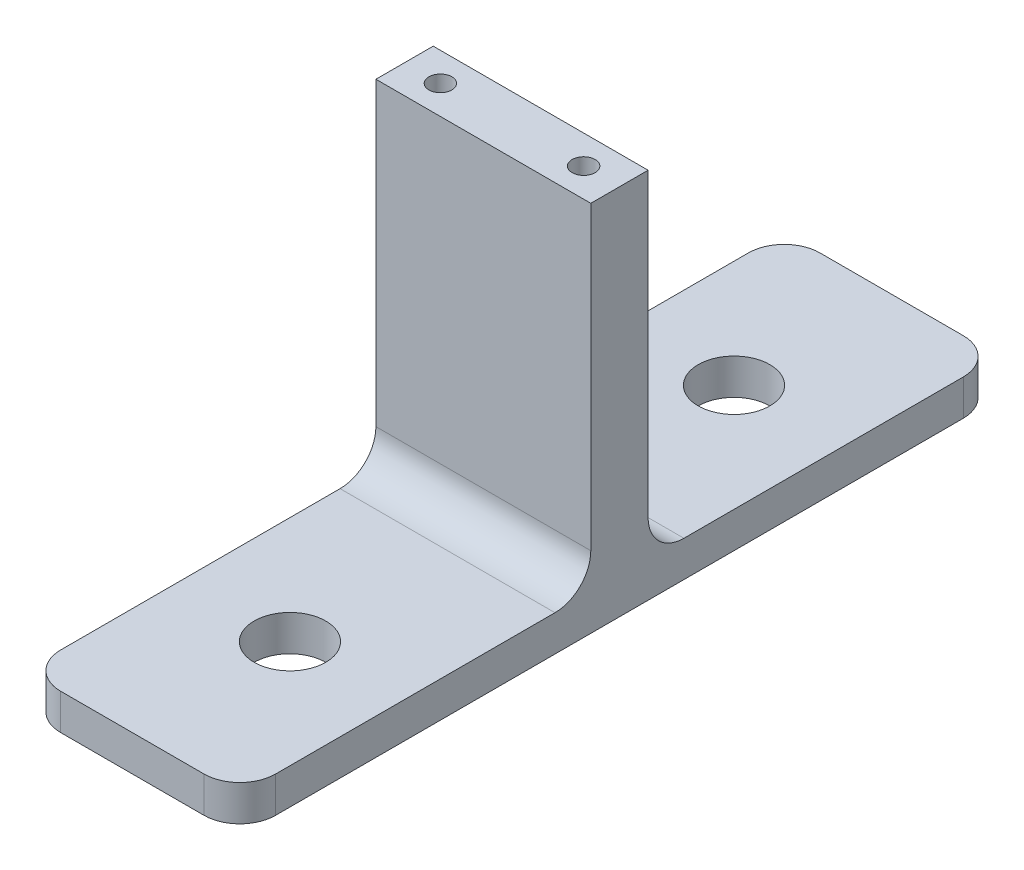
ISO-10303-21;
HEADER;
FILE_DESCRIPTION(('STEP AP214'),'2;1');
FILE_NAME('part.step','',(''),(''),'','','');
FILE_SCHEMA(('AUTOMOTIVE_DESIGN { 1 0 10303 214 1 1 1 1 }'));
ENDSEC;
DATA;
#1=APPLICATION_CONTEXT('core data for automotive mechanical design processes');
#2=APPLICATION_PROTOCOL_DEFINITION('international standard','automotive_design',2000,#1);
#3=PRODUCT_CONTEXT('',#1,'mechanical');
#4=PRODUCT('Part','Part','',(#3));
#5=PRODUCT_RELATED_PRODUCT_CATEGORY('part','',(#4));
#6=PRODUCT_DEFINITION_FORMATION('','',#4);
#7=PRODUCT_DEFINITION_CONTEXT('part definition',#1,'design');
#8=PRODUCT_DEFINITION('design','',#6,#7);
#9=PRODUCT_DEFINITION_SHAPE('','',#8);
#10=(LENGTH_UNIT() NAMED_UNIT(*) SI_UNIT(.MILLI.,.METRE.));
#11=(NAMED_UNIT(*) PLANE_ANGLE_UNIT() SI_UNIT($,.RADIAN.));
#12=(NAMED_UNIT(*) SI_UNIT($,.STERADIAN.) SOLID_ANGLE_UNIT());
#13=UNCERTAINTY_MEASURE_WITH_UNIT(LENGTH_MEASURE(1.E-05),#10,'distance_accuracy_value','');
#14=(GEOMETRIC_REPRESENTATION_CONTEXT(3) GLOBAL_UNCERTAINTY_ASSIGNED_CONTEXT((#13)) GLOBAL_UNIT_ASSIGNED_CONTEXT((#10,
#11,#12)) REPRESENTATION_CONTEXT('',''));
#15=CARTESIAN_POINT('',(0.,0.,0.));
#16=DIRECTION('',(0.,0.,1.));
#17=DIRECTION('',(1.,0.,0.));
#18=AXIS2_PLACEMENT_3D('',#15,#16,#17);
#19=CARTESIAN_POINT('',(30.,0.,0.));
#20=DIRECTION('',(0.,0.,1.));
#21=DIRECTION('',(1.,0.,0.));
#22=AXIS2_PLACEMENT_3D('',#19,#20,#21);
#23=PLANE('',#22);
#24=DIRECTION('',(-1.,0.,0.));
#25=VECTOR('',#24,1.);
#26=CARTESIAN_POINT('',(30.,0.,0.));
#27=LINE('',#26,#25);
#28=CARTESIAN_POINT('',(25.,0.,0.));
#29=VERTEX_POINT('',#28);
#30=CARTESIAN_POINT('',(5.,0.,0.));
#31=VERTEX_POINT('',#30);
#32=EDGE_CURVE('E183',#29,#31,#27,.T.);
#33=ORIENTED_EDGE('',*,*,#32,.F.);
#34=DIRECTION('',(0.,1.,0.));
#35=VECTOR('',#34,1.);
#36=CARTESIAN_POINT('',(25.,5.,0.));
#37=LINE('',#36,#35);
#38=CARTESIAN_POINT('',(25.,5.,0.));
#39=VERTEX_POINT('',#38);
#40=EDGE_CURVE('E207',#29,#39,#37,.T.);
#41=ORIENTED_EDGE('',*,*,#40,.T.);
#42=DIRECTION('',(-1.,0.,0.));
#43=VECTOR('',#42,1.);
#44=CARTESIAN_POINT('',(30.,5.,0.));
#45=LINE('',#44,#43);
#46=CARTESIAN_POINT('',(5.,5.,0.));
#47=VERTEX_POINT('',#46);
#48=EDGE_CURVE('E178',#39,#47,#45,.T.);
#49=ORIENTED_EDGE('',*,*,#48,.T.);
#50=DIRECTION('',(0.,1.,0.));
#51=VECTOR('',#50,1.);
#52=CARTESIAN_POINT('',(5.,0.,0.));
#53=LINE('',#52,#51);
#54=EDGE_CURVE('E205',#47,#31,#53,.F.);
#55=ORIENTED_EDGE('',*,*,#54,.T.);
#56=EDGE_LOOP('',(#33,#41,#49,#55));
#57=FACE_BOUND('',#56,.T.);
#58=ADVANCED_FACE('F33',(#57),#23,.T.);
#59=CARTESIAN_POINT('',(30.,0.,0.));
#60=DIRECTION('',(0.,1.,0.));
#61=DIRECTION('',(0.,0.,1.));
#62=AXIS2_PLACEMENT_3D('',#59,#60,#61);
#63=PLANE('',#62);
#64=CARTESIAN_POINT('',(15.,0.,-84.));
#65=DIRECTION('',(0.,-1.,0.));
#66=DIRECTION('',(0.,0.,-1.));
#67=AXIS2_PLACEMENT_3D('',#64,#65,#66);
#68=CIRCLE('',#67,5.);
#69=CARTESIAN_POINT('',(15.,0.,-89.));
#70=VERTEX_POINT('',#69);
#71=EDGE_CURVE('E245',#70,#70,#68,.T.);
#72=ORIENTED_EDGE('',*,*,#71,.F.);
#73=EDGE_LOOP('',(#72));
#74=FACE_BOUND('',#73,.T.);
#75=CARTESIAN_POINT('',(15.,0.,-22.));
#76=DIRECTION('',(0.,1.,0.));
#77=DIRECTION('',(0.,0.,1.));
#78=AXIS2_PLACEMENT_3D('',#75,#76,#77);
#79=CIRCLE('',#78,5.);
#80=CARTESIAN_POINT('',(15.,0.,-17.));
#81=VERTEX_POINT('',#80);
#82=EDGE_CURVE('E157',#81,#81,#79,.T.);
#83=ORIENTED_EDGE('',*,*,#82,.T.);
#84=EDGE_LOOP('',(#83));
#85=FACE_BOUND('',#84,.T.);
#86=DIRECTION('',(0.,0.,-1.));
#87=VECTOR('',#86,1.);
#88=CARTESIAN_POINT('',(0.,0.,0.));
#89=LINE('',#88,#87);
#90=CARTESIAN_POINT('',(0.,0.,-5.));
#91=VERTEX_POINT('',#90);
#92=CARTESIAN_POINT('',(0.,0.,-101.));
#93=VERTEX_POINT('',#92);
#94=EDGE_CURVE('E175',#91,#93,#89,.T.);
#95=ORIENTED_EDGE('',*,*,#94,.T.);
#96=CARTESIAN_POINT('',(5.,0.,-101.));
#97=DIRECTION('',(0.,1.,0.));
#98=DIRECTION('',(0.,0.,1.));
#99=AXIS2_PLACEMENT_3D('',#96,#97,#98);
#100=CIRCLE('',#99,5.);
#101=CARTESIAN_POINT('',(5.,0.,-106.));
#102=VERTEX_POINT('',#101);
#103=EDGE_CURVE('E227',#93,#102,#100,.F.);
#104=ORIENTED_EDGE('',*,*,#103,.T.);
#105=DIRECTION('',(-1.,0.,0.));
#106=VECTOR('',#105,1.);
#107=CARTESIAN_POINT('',(30.,0.,-106.));
#108=LINE('',#107,#106);
#109=CARTESIAN_POINT('',(25.,0.,-106.));
#110=VERTEX_POINT('',#109);
#111=EDGE_CURVE('E270',#110,#102,#108,.T.);
#112=ORIENTED_EDGE('',*,*,#111,.F.);
#113=CARTESIAN_POINT('',(25.,0.,-101.));
#114=DIRECTION('',(0.,1.,0.));
#115=DIRECTION('',(0.,0.,1.));
#116=AXIS2_PLACEMENT_3D('',#113,#114,#115);
#117=CIRCLE('',#116,5.);
#118=CARTESIAN_POINT('',(30.,0.,-101.));
#119=VERTEX_POINT('',#118);
#120=EDGE_CURVE('E54',#110,#119,#117,.F.);
#121=ORIENTED_EDGE('',*,*,#120,.T.);
#122=DIRECTION('',(0.,0.,-1.));
#123=VECTOR('',#122,1.);
#124=CARTESIAN_POINT('',(30.,0.,0.));
#125=LINE('',#124,#123);
#126=CARTESIAN_POINT('',(30.,0.,-5.));
#127=VERTEX_POINT('',#126);
#128=EDGE_CURVE('E177',#127,#119,#125,.T.);
#129=ORIENTED_EDGE('',*,*,#128,.F.);
#130=CARTESIAN_POINT('',(25.,0.,-5.));
#131=DIRECTION('',(0.,1.,0.));
#132=DIRECTION('',(0.,0.,1.));
#133=AXIS2_PLACEMENT_3D('',#130,#131,#132);
#134=CIRCLE('',#133,5.);
#135=EDGE_CURVE('E193',#127,#29,#134,.F.);
#136=ORIENTED_EDGE('',*,*,#135,.T.);
#137=ORIENTED_EDGE('',*,*,#32,.T.);
#138=CARTESIAN_POINT('',(5.,0.,-5.));
#139=DIRECTION('',(0.,1.,0.));
#140=DIRECTION('',(0.,0.,1.));
#141=AXIS2_PLACEMENT_3D('',#138,#139,#140);
#142=CIRCLE('',#141,5.);
#143=EDGE_CURVE('E191',#31,#91,#142,.F.);
#144=ORIENTED_EDGE('',*,*,#143,.T.);
#145=EDGE_LOOP('',(#95,#104,#112,#121,#129,#136,#137,#144));
#146=FACE_BOUND('',#145,.T.);
#147=ADVANCED_FACE('F284',(#74,#85,#146),#63,.F.);
#148=CARTESIAN_POINT('',(30.,0.,-57.));
#149=DIRECTION('',(0.,0.,1.));
#150=DIRECTION('',(1.,0.,0.));
#151=AXIS2_PLACEMENT_3D('',#148,#149,#150);
#152=PLANE('',#151);
#153=DIRECTION('',(0.,1.,0.));
#154=VECTOR('',#153,1.);
#155=CARTESIAN_POINT('',(30.,0.,-57.));
#156=LINE('',#155,#154);
#157=CARTESIAN_POINT('',(30.,10.,-57.));
#158=VERTEX_POINT('',#157);
#159=CARTESIAN_POINT('',(30.,52.,-57.));
#160=VERTEX_POINT('',#159);
#161=EDGE_CURVE('E174',#158,#160,#156,.T.);
#162=ORIENTED_EDGE('',*,*,#161,.F.);
#163=DIRECTION('',(-1.,0.,0.));
#164=VECTOR('',#163,1.);
#165=CARTESIAN_POINT('',(0.,10.,-57.));
#166=LINE('',#165,#164);
#167=CARTESIAN_POINT('',(0.,10.,-57.));
#168=VERTEX_POINT('',#167);
#169=EDGE_CURVE('E232',#158,#168,#166,.T.);
#170=ORIENTED_EDGE('',*,*,#169,.T.);
#171=DIRECTION('',(0.,1.,0.));
#172=VECTOR('',#171,1.);
#173=CARTESIAN_POINT('',(0.,0.,-57.));
#174=LINE('',#173,#172);
#175=CARTESIAN_POINT('',(0.,52.,-57.));
#176=VERTEX_POINT('',#175);
#177=EDGE_CURVE('E166',#168,#176,#174,.T.);
#178=ORIENTED_EDGE('',*,*,#177,.T.);
#179=DIRECTION('',(-1.,0.,0.));
#180=VECTOR('',#179,1.);
#181=CARTESIAN_POINT('',(0.,52.,-57.));
#182=LINE('',#181,#180);
#183=EDGE_CURVE('E154',#160,#176,#182,.T.);
#184=ORIENTED_EDGE('',*,*,#183,.F.);
#185=EDGE_LOOP('',(#162,#170,#178,#184));
#186=FACE_BOUND('',#185,.T.);
#187=ADVANCED_FACE('F248',(#186),#152,.F.);
#188=CARTESIAN_POINT('',(30.,5.,0.));
#189=DIRECTION('',(0.,1.,0.));
#190=DIRECTION('',(0.,0.,1.));
#191=AXIS2_PLACEMENT_3D('',#188,#189,#190);
#192=PLANE('',#191);
#193=CARTESIAN_POINT('',(15.,5.,-22.));
#194=DIRECTION('',(0.,1.,0.));
#195=DIRECTION('',(0.,0.,1.));
#196=AXIS2_PLACEMENT_3D('',#193,#194,#195);
#197=CIRCLE('',#196,5.);
#198=CARTESIAN_POINT('',(15.,5.,-17.));
#199=VERTEX_POINT('',#198);
#200=EDGE_CURVE('E252',#199,#199,#197,.T.);
#201=ORIENTED_EDGE('',*,*,#200,.F.);
#202=EDGE_LOOP('',(#201));
#203=FACE_BOUND('',#202,.T.);
#204=DIRECTION('',(0.,0.,-1.));
#205=VECTOR('',#204,1.);
#206=CARTESIAN_POINT('',(30.,5.,0.));
#207=LINE('',#206,#205);
#208=CARTESIAN_POINT('',(30.,5.,-5.));
#209=VERTEX_POINT('',#208);
#210=CARTESIAN_POINT('',(30.,5.,-44.));
#211=VERTEX_POINT('',#210);
#212=EDGE_CURVE('E171',#209,#211,#207,.T.);
#213=ORIENTED_EDGE('',*,*,#212,.T.);
#214=DIRECTION('',(1.,0.,0.));
#215=VECTOR('',#214,1.);
#216=CARTESIAN_POINT('',(30.,5.,-44.));
#217=LINE('',#216,#215);
#218=CARTESIAN_POINT('',(0.,5.,-44.));
#219=VERTEX_POINT('',#218);
#220=EDGE_CURVE('E203',#211,#219,#217,.F.);
#221=ORIENTED_EDGE('',*,*,#220,.T.);
#222=DIRECTION('',(0.,0.,-1.));
#223=VECTOR('',#222,1.);
#224=CARTESIAN_POINT('',(0.,5.,0.));
#225=LINE('',#224,#223);
#226=CARTESIAN_POINT('',(0.,5.,-5.));
#227=VERTEX_POINT('',#226);
#228=EDGE_CURVE('E164',#227,#219,#225,.T.);
#229=ORIENTED_EDGE('',*,*,#228,.F.);
#230=CARTESIAN_POINT('',(5.,5.,-5.));
#231=DIRECTION('',(0.,1.,0.));
#232=DIRECTION('',(0.,0.,1.));
#233=AXIS2_PLACEMENT_3D('',#230,#231,#232);
#234=CIRCLE('',#233,5.);
#235=EDGE_CURVE('E199',#227,#47,#234,.T.);
#236=ORIENTED_EDGE('',*,*,#235,.T.);
#237=ORIENTED_EDGE('',*,*,#48,.F.);
#238=CARTESIAN_POINT('',(25.,5.,-5.));
#239=DIRECTION('',(0.,1.,0.));
#240=DIRECTION('',(0.,0.,1.));
#241=AXIS2_PLACEMENT_3D('',#238,#239,#240);
#242=CIRCLE('',#241,5.);
#243=EDGE_CURVE('E201',#39,#209,#242,.T.);
#244=ORIENTED_EDGE('',*,*,#243,.T.);
#245=EDGE_LOOP('',(#213,#221,#229,#236,#237,#244));
#246=FACE_BOUND('',#245,.T.);
#247=ADVANCED_FACE('F314',(#203,#246),#192,.T.);
#248=CARTESIAN_POINT('',(30.,0.,0.));
#249=DIRECTION('',(-1.,0.,0.));
#250=DIRECTION('',(0.,0.,1.));
#251=AXIS2_PLACEMENT_3D('',#248,#249,#250);
#252=PLANE('',#251);
#253=ORIENTED_EDGE('',*,*,#128,.T.);
#254=DIRECTION('',(0.,1.,0.));
#255=VECTOR('',#254,1.);
#256=CARTESIAN_POINT('',(30.,0.,-101.));
#257=LINE('',#256,#255);
#258=CARTESIAN_POINT('',(30.,5.,-101.));
#259=VERTEX_POINT('',#258);
#260=EDGE_CURVE('E229',#119,#259,#257,.T.);
#261=ORIENTED_EDGE('',*,*,#260,.T.);
#262=DIRECTION('',(0.,0.,1.));
#263=VECTOR('',#262,1.);
#264=CARTESIAN_POINT('',(30.,5.,-106.));
#265=LINE('',#264,#263);
#266=CARTESIAN_POINT('',(30.,5.,-62.));
#267=VERTEX_POINT('',#266);
#268=EDGE_CURVE('E244',#259,#267,#265,.T.);
#269=ORIENTED_EDGE('',*,*,#268,.T.);
#270=CARTESIAN_POINT('',(30.,10.,-62.));
#271=DIRECTION('',(-1.,0.,0.));
#272=DIRECTION('',(0.,0.,1.));
#273=AXIS2_PLACEMENT_3D('',#270,#271,#272);
#274=CIRCLE('',#273,5.);
#275=EDGE_CURVE('E11',#267,#158,#274,.T.);
#276=ORIENTED_EDGE('',*,*,#275,.T.);
#277=ORIENTED_EDGE('',*,*,#161,.T.);
#278=DIRECTION('',(0.,0.,-1.));
#279=VECTOR('',#278,1.);
#280=CARTESIAN_POINT('',(30.,52.,-57.));
#281=LINE('',#280,#279);
#282=CARTESIAN_POINT('',(30.,52.,-49.));
#283=VERTEX_POINT('',#282);
#284=EDGE_CURVE('E147',#283,#160,#281,.T.);
#285=ORIENTED_EDGE('',*,*,#284,.F.);
#286=DIRECTION('',(0.,-1.,0.));
#287=VECTOR('',#286,1.);
#288=CARTESIAN_POINT('',(30.,52.,-49.));
#289=LINE('',#288,#287);
#290=CARTESIAN_POINT('',(30.,10.,-49.));
#291=VERTEX_POINT('',#290);
#292=EDGE_CURVE('E143',#283,#291,#289,.T.);
#293=ORIENTED_EDGE('',*,*,#292,.T.);
#294=CARTESIAN_POINT('',(30.,10.,-44.));
#295=DIRECTION('',(-1.,0.,0.));
#296=DIRECTION('',(0.,0.,1.));
#297=AXIS2_PLACEMENT_3D('',#294,#295,#296);
#298=CIRCLE('',#297,5.);
#299=EDGE_CURVE('E210',#291,#211,#298,.T.);
#300=ORIENTED_EDGE('',*,*,#299,.T.);
#301=ORIENTED_EDGE('',*,*,#212,.F.);
#302=DIRECTION('',(0.,1.,0.));
#303=VECTOR('',#302,1.);
#304=CARTESIAN_POINT('',(30.,0.,-5.));
#305=LINE('',#304,#303);
#306=EDGE_CURVE('E195',#209,#127,#305,.F.);
#307=ORIENTED_EDGE('',*,*,#306,.T.);
#308=EDGE_LOOP('',(#253,#261,#269,#276,#277,#285,#293,#300,#301,#307));
#309=FACE_BOUND('',#308,.T.);
#310=ADVANCED_FACE('F249',(#309),#252,.F.);
#311=CARTESIAN_POINT('',(0.,0.,0.));
#312=DIRECTION('',(-1.,0.,0.));
#313=DIRECTION('',(0.,0.,1.));
#314=AXIS2_PLACEMENT_3D('',#311,#312,#313);
#315=PLANE('',#314);
#316=DIRECTION('',(0.,0.,1.));
#317=VECTOR('',#316,1.);
#318=CARTESIAN_POINT('',(0.,5.,-106.));
#319=LINE('',#318,#317);
#320=CARTESIAN_POINT('',(0.,5.,-101.));
#321=VERTEX_POINT('',#320);
#322=CARTESIAN_POINT('',(0.,5.,-62.));
#323=VERTEX_POINT('',#322);
#324=EDGE_CURVE('E235',#321,#323,#319,.T.);
#325=ORIENTED_EDGE('',*,*,#324,.F.);
#326=DIRECTION('',(0.,1.,0.));
#327=VECTOR('',#326,1.);
#328=CARTESIAN_POINT('',(0.,0.,-101.));
#329=LINE('',#328,#327);
#330=EDGE_CURVE('E224',#321,#93,#329,.F.);
#331=ORIENTED_EDGE('',*,*,#330,.T.);
#332=ORIENTED_EDGE('',*,*,#94,.F.);
#333=DIRECTION('',(0.,1.,0.));
#334=VECTOR('',#333,1.);
#335=CARTESIAN_POINT('',(0.,0.,-5.));
#336=LINE('',#335,#334);
#337=EDGE_CURVE('E186',#91,#227,#336,.T.);
#338=ORIENTED_EDGE('',*,*,#337,.T.);
#339=ORIENTED_EDGE('',*,*,#228,.T.);
#340=CARTESIAN_POINT('',(0.,10.,-44.));
#341=DIRECTION('',(-1.,0.,0.));
#342=DIRECTION('',(0.,0.,1.));
#343=AXIS2_PLACEMENT_3D('',#340,#341,#342);
#344=CIRCLE('',#343,5.);
#345=CARTESIAN_POINT('',(0.,10.,-49.));
#346=VERTEX_POINT('',#345);
#347=EDGE_CURVE('E163',#219,#346,#344,.F.);
#348=ORIENTED_EDGE('',*,*,#347,.T.);
#349=DIRECTION('',(0.,-1.,0.));
#350=VECTOR('',#349,1.);
#351=CARTESIAN_POINT('',(0.,52.,-49.));
#352=LINE('',#351,#350);
#353=CARTESIAN_POINT('',(0.,52.,-49.));
#354=VERTEX_POINT('',#353);
#355=EDGE_CURVE('E140',#354,#346,#352,.T.);
#356=ORIENTED_EDGE('',*,*,#355,.F.);
#357=DIRECTION('',(0.,0.,1.));
#358=VECTOR('',#357,1.);
#359=CARTESIAN_POINT('',(0.,52.,-57.));
#360=LINE('',#359,#358);
#361=EDGE_CURVE('E148',#176,#354,#360,.T.);
#362=ORIENTED_EDGE('',*,*,#361,.F.);
#363=ORIENTED_EDGE('',*,*,#177,.F.);
#364=CARTESIAN_POINT('',(0.,10.,-62.));
#365=DIRECTION('',(-1.,0.,0.));
#366=DIRECTION('',(0.,0.,1.));
#367=AXIS2_PLACEMENT_3D('',#364,#365,#366);
#368=CIRCLE('',#367,5.);
#369=EDGE_CURVE('E41',#168,#323,#368,.F.);
#370=ORIENTED_EDGE('',*,*,#369,.T.);
#371=EDGE_LOOP('',(#325,#331,#332,#338,#339,#348,#356,#362,#363,#370));
#372=FACE_BOUND('',#371,.T.);
#373=ADVANCED_FACE('F160',(#372),#315,.T.);
#374=CARTESIAN_POINT('',(0.,52.,-49.));
#375=DIRECTION('',(0.,0.,-1.));
#376=DIRECTION('',(-1.,0.,0.));
#377=AXIS2_PLACEMENT_3D('',#374,#375,#376);
#378=PLANE('',#377);
#379=ORIENTED_EDGE('',*,*,#355,.T.);
#380=DIRECTION('',(1.,0.,0.));
#381=VECTOR('',#380,1.);
#382=CARTESIAN_POINT('',(0.,10.,-49.));
#383=LINE('',#382,#381);
#384=EDGE_CURVE('E197',#346,#291,#383,.T.);
#385=ORIENTED_EDGE('',*,*,#384,.T.);
#386=ORIENTED_EDGE('',*,*,#292,.F.);
#387=DIRECTION('',(1.,0.,0.));
#388=VECTOR('',#387,1.);
#389=CARTESIAN_POINT('',(0.,52.,-49.));
#390=LINE('',#389,#388);
#391=EDGE_CURVE('E135',#354,#283,#390,.T.);
#392=ORIENTED_EDGE('',*,*,#391,.F.);
#393=EDGE_LOOP('',(#379,#385,#386,#392));
#394=FACE_BOUND('',#393,.T.);
#395=ADVANCED_FACE('F137',(#394),#378,.F.);
#396=CARTESIAN_POINT('',(0.,52.,0.));
#397=DIRECTION('',(0.,1.,0.));
#398=DIRECTION('',(0.,0.,1.));
#399=AXIS2_PLACEMENT_3D('',#396,#397,#398);
#400=PLANE('',#399);
#401=CARTESIAN_POINT('',(5.,52.,-53.));
#402=DIRECTION('',(0.,1.,0.));
#403=DIRECTION('',(0.,0.,1.));
#404=AXIS2_PLACEMENT_3D('',#401,#402,#403);
#405=CIRCLE('',#404,1.6);
#406=CARTESIAN_POINT('',(5.,52.,-51.4));
#407=VERTEX_POINT('',#406);
#408=EDGE_CURVE('E265',#407,#407,#405,.T.);
#409=ORIENTED_EDGE('',*,*,#408,.F.);
#410=EDGE_LOOP('',(#409));
#411=FACE_BOUND('',#410,.T.);
#412=CARTESIAN_POINT('',(25.,52.,-53.));
#413=DIRECTION('',(0.,1.,0.));
#414=DIRECTION('',(0.,0.,1.));
#415=AXIS2_PLACEMENT_3D('',#412,#413,#414);
#416=CIRCLE('',#415,1.6);
#417=CARTESIAN_POINT('',(25.,52.,-51.4));
#418=VERTEX_POINT('',#417);
#419=EDGE_CURVE('E258',#418,#418,#416,.T.);
#420=ORIENTED_EDGE('',*,*,#419,.F.);
#421=EDGE_LOOP('',(#420));
#422=FACE_BOUND('',#421,.T.);
#423=ORIENTED_EDGE('',*,*,#361,.T.);
#424=ORIENTED_EDGE('',*,*,#391,.T.);
#425=ORIENTED_EDGE('',*,*,#284,.T.);
#426=ORIENTED_EDGE('',*,*,#183,.T.);
#427=EDGE_LOOP('',(#423,#424,#425,#426));
#428=FACE_BOUND('',#427,.T.);
#429=ADVANCED_FACE('F152',(#411,#422,#428),#400,.T.);
#430=CARTESIAN_POINT('',(15.,0.,-22.));
#431=DIRECTION('',(0.,1.,0.));
#432=DIRECTION('',(0.,0.,1.));
#433=AXIS2_PLACEMENT_3D('',#430,#431,#432);
#434=CYLINDRICAL_SURFACE('',#433,5.);
#435=ORIENTED_EDGE('',*,*,#82,.F.);
#436=EDGE_LOOP('',(#435));
#437=FACE_BOUND('',#436,.T.);
#438=ORIENTED_EDGE('',*,*,#200,.T.);
#439=EDGE_LOOP('',(#438));
#440=FACE_BOUND('',#439,.T.);
#441=ADVANCED_FACE('F350',(#437,#440),#434,.F.);
#442=CARTESIAN_POINT('',(25.,38.,-53.));
#443=DIRECTION('',(0.,1.,0.));
#444=DIRECTION('',(0.,0.,1.));
#445=AXIS2_PLACEMENT_3D('',#442,#443,#444);
#446=CYLINDRICAL_SURFACE('',#445,1.6);
#447=CARTESIAN_POINT('',(25.,38.,-53.));
#448=DIRECTION('',(0.,1.,0.));
#449=DIRECTION('',(0.,0.,1.));
#450=AXIS2_PLACEMENT_3D('',#447,#448,#449);
#451=CIRCLE('',#450,1.6);
#452=CARTESIAN_POINT('',(25.,38.,-51.4));
#453=VERTEX_POINT('',#452);
#454=EDGE_CURVE('E261',#453,#453,#451,.T.);
#455=CARTESIAN_POINT('',(25.,38.,-51.4));
#456=CARTESIAN_POINT('',(25.,38.1458333333333,-51.4));
#457=CARTESIAN_POINT('',(25.,38.2916666666667,-51.4));
#458=CARTESIAN_POINT('',(25.,38.5833333333333,-51.4));
#459=CARTESIAN_POINT('',(25.,38.7291666666667,-51.4));
#460=CARTESIAN_POINT('',(25.,39.0208333333333,-51.4));
#461=CARTESIAN_POINT('',(25.,39.1666666666667,-51.4));
#462=CARTESIAN_POINT('',(25.,39.4583333333333,-51.4));
#463=CARTESIAN_POINT('',(25.,39.6041666666667,-51.4));
#464=CARTESIAN_POINT('',(25.,39.8958333333333,-51.4));
#465=CARTESIAN_POINT('',(25.,40.0416666666667,-51.4));
#466=CARTESIAN_POINT('',(25.,40.3333333333333,-51.4));
#467=CARTESIAN_POINT('',(25.,40.4791666666667,-51.4));
#468=CARTESIAN_POINT('',(25.,40.7708333333333,-51.4));
#469=CARTESIAN_POINT('',(25.,40.9166666666667,-51.4));
#470=CARTESIAN_POINT('',(25.,41.2083333333333,-51.4));
#471=CARTESIAN_POINT('',(25.,41.3541666666667,-51.4));
#472=CARTESIAN_POINT('',(25.,41.6458333333333,-51.4));
#473=CARTESIAN_POINT('',(25.,41.7916666666667,-51.4));
#474=CARTESIAN_POINT('',(25.,42.0833333333333,-51.4));
#475=CARTESIAN_POINT('',(25.,42.2291666666667,-51.4));
#476=CARTESIAN_POINT('',(25.,42.5208333333333,-51.4));
#477=CARTESIAN_POINT('',(25.,42.6666666666667,-51.4));
#478=CARTESIAN_POINT('',(25.,42.9583333333333,-51.4));
#479=CARTESIAN_POINT('',(25.,43.1041666666667,-51.4));
#480=CARTESIAN_POINT('',(25.,43.3958333333333,-51.4));
#481=CARTESIAN_POINT('',(25.,43.5416666666667,-51.4));
#482=CARTESIAN_POINT('',(25.,43.8333333333333,-51.4));
#483=CARTESIAN_POINT('',(25.,43.9791666666667,-51.4));
#484=CARTESIAN_POINT('',(25.,44.2708333333333,-51.4));
#485=CARTESIAN_POINT('',(25.,44.4166666666667,-51.4));
#486=CARTESIAN_POINT('',(25.,44.7083333333333,-51.4));
#487=CARTESIAN_POINT('',(25.,44.8541666666667,-51.4));
#488=CARTESIAN_POINT('',(25.,45.1458333333333,-51.4));
#489=CARTESIAN_POINT('',(25.,45.2916666666667,-51.4));
#490=CARTESIAN_POINT('',(25.,45.5833333333333,-51.4));
#491=CARTESIAN_POINT('',(25.,45.7291666666667,-51.4));
#492=CARTESIAN_POINT('',(25.,46.0208333333333,-51.4));
#493=CARTESIAN_POINT('',(25.,46.1666666666667,-51.4));
#494=CARTESIAN_POINT('',(25.,46.4583333333333,-51.4));
#495=CARTESIAN_POINT('',(25.,46.6041666666667,-51.4));
#496=CARTESIAN_POINT('',(25.,46.8958333333333,-51.4));
#497=CARTESIAN_POINT('',(25.,47.0416666666667,-51.4));
#498=CARTESIAN_POINT('',(25.,47.3333333333333,-51.4));
#499=CARTESIAN_POINT('',(25.,47.4791666666667,-51.4));
#500=CARTESIAN_POINT('',(25.,47.7708333333333,-51.4));
#501=CARTESIAN_POINT('',(25.,47.9166666666667,-51.4));
#502=CARTESIAN_POINT('',(25.,48.2083333333333,-51.4));
#503=CARTESIAN_POINT('',(25.,48.3541666666667,-51.4));
#504=CARTESIAN_POINT('',(25.,48.6458333333333,-51.4));
#505=CARTESIAN_POINT('',(25.,48.7916666666667,-51.4));
#506=CARTESIAN_POINT('',(25.,49.0833333333333,-51.4));
#507=CARTESIAN_POINT('',(25.,49.2291666666667,-51.4));
#508=CARTESIAN_POINT('',(25.,49.5208333333333,-51.4));
#509=CARTESIAN_POINT('',(25.,49.6666666666667,-51.4));
#510=CARTESIAN_POINT('',(25.,49.9583333333333,-51.4));
#511=CARTESIAN_POINT('',(25.,50.1041666666667,-51.4));
#512=CARTESIAN_POINT('',(25.,50.3958333333333,-51.4));
#513=CARTESIAN_POINT('',(25.,50.5416666666667,-51.4));
#514=CARTESIAN_POINT('',(25.,50.8333333333333,-51.4));
#515=CARTESIAN_POINT('',(25.,50.9791666666667,-51.4));
#516=CARTESIAN_POINT('',(25.,51.2708333333333,-51.4));
#517=CARTESIAN_POINT('',(25.,51.4166666666667,-51.4));
#518=CARTESIAN_POINT('',(25.,51.7083333333333,-51.4));
#519=CARTESIAN_POINT('',(25.,51.8541666666667,-51.4));
#520=CARTESIAN_POINT('',(25.,52.,-51.4));
#521=B_SPLINE_CURVE_WITH_KNOTS('',3,(#455,#456,#457,#458,#459,#460,#461,#462,#463,#464,#465,
#466,#467,#468,#469,#470,#471,#472,#473,#474,#475,#476,#477,#478,#479,#480,#481,#482,#483,#484,
#485,#486,#487,#488,#489,#490,#491,#492,#493,#494,#495,#496,#497,#498,#499,#500,#501,#502,#503,
#504,#505,#506,#507,#508,#509,#510,#511,#512,#513,#514,#515,#516,#517,#518,#519,#520),
.UNSPECIFIED.,.F.,.F.,(4,2,2,2,2,2,2,2,2,2,2,2,2,2,2,2,2,2,2,2,2,2,2,2,2,2,2,2,2,2,2,2,4),(0.,
0.4375,0.875000000000001,1.3125,1.75,2.1875,2.625,3.0625,3.5,3.9375,4.375,4.8125,5.25,
5.68750000000001,6.12500000000001,6.56250000000001,7.00000000000001,7.43750000000001,
7.87500000000001,8.3125,8.75,9.1875,9.625,10.0625,10.5,10.9375,11.375,11.8125,12.25,12.6875,
13.125,13.5625,14.),.UNSPECIFIED.);
#522=EDGE_CURVE('BSEAM354',#453,#418,#521,.T.);
#523=ORIENTED_EDGE('',*,*,#454,.F.);
#524=ORIENTED_EDGE('',*,*,#419,.T.);
#525=ORIENTED_EDGE('',*,*,#522,.T.);
#526=ORIENTED_EDGE('',*,*,#522,.F.);
#527=EDGE_LOOP('',(#523,#525,#524,#526));
#528=FACE_BOUND('',#527,.T.);
#529=ADVANCED_FACE('F354',(#528),#446,.F.);
#530=CARTESIAN_POINT('',(25.,38.,-53.));
#531=DIRECTION('',(0.,1.,0.));
#532=DIRECTION('',(0.,0.,1.));
#533=AXIS2_PLACEMENT_3D('',#530,#531,#532);
#534=PLANE('',#533);
#535=ORIENTED_EDGE('',*,*,#454,.T.);
#536=EDGE_LOOP('',(#535));
#537=FACE_BOUND('',#536,.T.);
#538=ADVANCED_FACE('F358',(#537),#534,.T.);
#539=CARTESIAN_POINT('',(5.,38.,-53.));
#540=DIRECTION('',(0.,1.,0.));
#541=DIRECTION('',(0.,0.,1.));
#542=AXIS2_PLACEMENT_3D('',#539,#540,#541);
#543=CYLINDRICAL_SURFACE('',#542,1.6);
#544=CARTESIAN_POINT('',(5.,38.,-53.));
#545=DIRECTION('',(0.,1.,0.));
#546=DIRECTION('',(0.,0.,1.));
#547=AXIS2_PLACEMENT_3D('',#544,#545,#546);
#548=CIRCLE('',#547,1.6);
#549=CARTESIAN_POINT('',(5.,38.,-51.4));
#550=VERTEX_POINT('',#549);
#551=EDGE_CURVE('E255',#550,#550,#548,.T.);
#552=CARTESIAN_POINT('',(5.,38.,-51.4));
#553=CARTESIAN_POINT('',(5.,38.1458333333333,-51.4));
#554=CARTESIAN_POINT('',(5.,38.2916666666667,-51.4));
#555=CARTESIAN_POINT('',(5.,38.5833333333333,-51.4));
#556=CARTESIAN_POINT('',(5.,38.7291666666667,-51.4));
#557=CARTESIAN_POINT('',(5.,39.0208333333333,-51.4));
#558=CARTESIAN_POINT('',(5.,39.1666666666667,-51.4));
#559=CARTESIAN_POINT('',(5.,39.4583333333333,-51.4));
#560=CARTESIAN_POINT('',(5.,39.6041666666667,-51.4));
#561=CARTESIAN_POINT('',(5.,39.8958333333333,-51.4));
#562=CARTESIAN_POINT('',(5.,40.0416666666667,-51.4));
#563=CARTESIAN_POINT('',(5.,40.3333333333333,-51.4));
#564=CARTESIAN_POINT('',(5.,40.4791666666667,-51.4));
#565=CARTESIAN_POINT('',(5.,40.7708333333333,-51.4));
#566=CARTESIAN_POINT('',(5.,40.9166666666667,-51.4));
#567=CARTESIAN_POINT('',(5.,41.2083333333333,-51.4));
#568=CARTESIAN_POINT('',(5.,41.3541666666667,-51.4));
#569=CARTESIAN_POINT('',(5.,41.6458333333333,-51.4));
#570=CARTESIAN_POINT('',(5.,41.7916666666667,-51.4));
#571=CARTESIAN_POINT('',(5.,42.0833333333333,-51.4));
#572=CARTESIAN_POINT('',(5.,42.2291666666667,-51.4));
#573=CARTESIAN_POINT('',(5.,42.5208333333333,-51.4));
#574=CARTESIAN_POINT('',(5.,42.6666666666667,-51.4));
#575=CARTESIAN_POINT('',(5.,42.9583333333333,-51.4));
#576=CARTESIAN_POINT('',(5.,43.1041666666667,-51.4));
#577=CARTESIAN_POINT('',(5.,43.3958333333333,-51.4));
#578=CARTESIAN_POINT('',(5.,43.5416666666667,-51.4));
#579=CARTESIAN_POINT('',(5.,43.8333333333333,-51.4));
#580=CARTESIAN_POINT('',(5.,43.9791666666667,-51.4));
#581=CARTESIAN_POINT('',(5.,44.2708333333333,-51.4));
#582=CARTESIAN_POINT('',(5.,44.4166666666667,-51.4));
#583=CARTESIAN_POINT('',(5.,44.7083333333333,-51.4));
#584=CARTESIAN_POINT('',(5.,44.8541666666667,-51.4));
#585=CARTESIAN_POINT('',(5.,45.1458333333333,-51.4));
#586=CARTESIAN_POINT('',(5.,45.2916666666667,-51.4));
#587=CARTESIAN_POINT('',(5.,45.5833333333333,-51.4));
#588=CARTESIAN_POINT('',(5.,45.7291666666667,-51.4));
#589=CARTESIAN_POINT('',(5.,46.0208333333333,-51.4));
#590=CARTESIAN_POINT('',(5.,46.1666666666667,-51.4));
#591=CARTESIAN_POINT('',(5.,46.4583333333333,-51.4));
#592=CARTESIAN_POINT('',(5.,46.6041666666667,-51.4));
#593=CARTESIAN_POINT('',(5.,46.8958333333333,-51.4));
#594=CARTESIAN_POINT('',(5.,47.0416666666667,-51.4));
#595=CARTESIAN_POINT('',(5.,47.3333333333333,-51.4));
#596=CARTESIAN_POINT('',(5.,47.4791666666667,-51.4));
#597=CARTESIAN_POINT('',(5.,47.7708333333333,-51.4));
#598=CARTESIAN_POINT('',(5.,47.9166666666667,-51.4));
#599=CARTESIAN_POINT('',(5.,48.2083333333333,-51.4));
#600=CARTESIAN_POINT('',(5.,48.3541666666667,-51.4));
#601=CARTESIAN_POINT('',(5.,48.6458333333333,-51.4));
#602=CARTESIAN_POINT('',(5.,48.7916666666667,-51.4));
#603=CARTESIAN_POINT('',(5.,49.0833333333333,-51.4));
#604=CARTESIAN_POINT('',(5.,49.2291666666667,-51.4));
#605=CARTESIAN_POINT('',(5.,49.5208333333333,-51.4));
#606=CARTESIAN_POINT('',(5.,49.6666666666667,-51.4));
#607=CARTESIAN_POINT('',(5.,49.9583333333333,-51.4));
#608=CARTESIAN_POINT('',(5.,50.1041666666667,-51.4));
#609=CARTESIAN_POINT('',(5.,50.3958333333333,-51.4));
#610=CARTESIAN_POINT('',(5.,50.5416666666667,-51.4));
#611=CARTESIAN_POINT('',(5.,50.8333333333333,-51.4));
#612=CARTESIAN_POINT('',(5.,50.9791666666667,-51.4));
#613=CARTESIAN_POINT('',(5.,51.2708333333333,-51.4));
#614=CARTESIAN_POINT('',(5.,51.4166666666667,-51.4));
#615=CARTESIAN_POINT('',(5.,51.7083333333333,-51.4));
#616=CARTESIAN_POINT('',(5.,51.8541666666667,-51.4));
#617=CARTESIAN_POINT('',(5.,52.,-51.4));
#618=B_SPLINE_CURVE_WITH_KNOTS('',3,(#552,#553,#554,#555,#556,#557,#558,#559,#560,#561,#562,
#563,#564,#565,#566,#567,#568,#569,#570,#571,#572,#573,#574,#575,#576,#577,#578,#579,#580,#581,
#582,#583,#584,#585,#586,#587,#588,#589,#590,#591,#592,#593,#594,#595,#596,#597,#598,#599,#600,
#601,#602,#603,#604,#605,#606,#607,#608,#609,#610,#611,#612,#613,#614,#615,#616,#617),
.UNSPECIFIED.,.F.,.F.,(4,2,2,2,2,2,2,2,2,2,2,2,2,2,2,2,2,2,2,2,2,2,2,2,2,2,2,2,2,2,2,2,4),(0.,
0.4375,0.875000000000001,1.3125,1.75,2.1875,2.625,3.0625,3.5,3.9375,4.375,4.8125,5.25,
5.68750000000001,6.12500000000001,6.56250000000001,7.00000000000001,7.43750000000001,
7.87500000000001,8.3125,8.75,9.1875,9.625,10.0625,10.5,10.9375,11.375,11.8125,12.25,12.6875,
13.125,13.5625,14.),.UNSPECIFIED.);
#619=EDGE_CURVE('BSEAM329',#550,#407,#618,.T.);
#620=ORIENTED_EDGE('',*,*,#551,.F.);
#621=ORIENTED_EDGE('',*,*,#408,.T.);
#622=ORIENTED_EDGE('',*,*,#619,.T.);
#623=ORIENTED_EDGE('',*,*,#619,.F.);
#624=EDGE_LOOP('',(#620,#622,#621,#623));
#625=FACE_BOUND('',#624,.T.);
#626=ADVANCED_FACE('F329',(#625),#543,.F.);
#627=CARTESIAN_POINT('',(5.,38.,-53.));
#628=DIRECTION('',(0.,1.,0.));
#629=DIRECTION('',(0.,0.,1.));
#630=AXIS2_PLACEMENT_3D('',#627,#628,#629);
#631=PLANE('',#630);
#632=ORIENTED_EDGE('',*,*,#551,.T.);
#633=EDGE_LOOP('',(#632));
#634=FACE_BOUND('',#633,.T.);
#635=ADVANCED_FACE('F322',(#634),#631,.T.);
#636=CARTESIAN_POINT('',(0.,10.,-44.));
#637=DIRECTION('',(1.,0.,0.));
#638=DIRECTION('',(0.,0.,-1.));
#639=AXIS2_PLACEMENT_3D('',#636,#637,#638);
#640=CYLINDRICAL_SURFACE('',#639,5.);
#641=ORIENTED_EDGE('',*,*,#347,.F.);
#642=ORIENTED_EDGE('',*,*,#220,.F.);
#643=ORIENTED_EDGE('',*,*,#299,.F.);
#644=ORIENTED_EDGE('',*,*,#384,.F.);
#645=EDGE_LOOP('',(#641,#642,#643,#644));
#646=FACE_BOUND('',#645,.T.);
#647=ADVANCED_FACE('F320',(#646),#640,.F.);
#648=CARTESIAN_POINT('',(25.,0.,-5.));
#649=DIRECTION('',(0.,-1.,0.));
#650=DIRECTION('',(0.,0.,-1.));
#651=AXIS2_PLACEMENT_3D('',#648,#649,#650);
#652=CYLINDRICAL_SURFACE('',#651,5.);
#653=ORIENTED_EDGE('',*,*,#135,.F.);
#654=ORIENTED_EDGE('',*,*,#306,.F.);
#655=ORIENTED_EDGE('',*,*,#243,.F.);
#656=ORIENTED_EDGE('',*,*,#40,.F.);
#657=EDGE_LOOP('',(#653,#654,#655,#656));
#658=FACE_BOUND('',#657,.T.);
#659=ADVANCED_FACE('F309',(#658),#652,.T.);
#660=CARTESIAN_POINT('',(5.,0.,-5.));
#661=DIRECTION('',(0.,1.,0.));
#662=DIRECTION('',(0.,0.,1.));
#663=AXIS2_PLACEMENT_3D('',#660,#661,#662);
#664=CYLINDRICAL_SURFACE('',#663,5.);
#665=ORIENTED_EDGE('',*,*,#143,.F.);
#666=ORIENTED_EDGE('',*,*,#54,.F.);
#667=ORIENTED_EDGE('',*,*,#235,.F.);
#668=ORIENTED_EDGE('',*,*,#337,.F.);
#669=EDGE_LOOP('',(#665,#666,#667,#668));
#670=FACE_BOUND('',#669,.T.);
#671=ADVANCED_FACE('F317',(#670),#664,.T.);
#672=CARTESIAN_POINT('',(30.,0.,-106.));
#673=DIRECTION('',(0.,0.,1.));
#674=DIRECTION('',(1.,0.,0.));
#675=AXIS2_PLACEMENT_3D('',#672,#673,#674);
#676=PLANE('',#675);
#677=ORIENTED_EDGE('',*,*,#111,.T.);
#678=DIRECTION('',(0.,1.,0.));
#679=VECTOR('',#678,1.);
#680=CARTESIAN_POINT('',(5.,5.,-106.));
#681=LINE('',#680,#679);
#682=CARTESIAN_POINT('',(5.,5.,-106.));
#683=VERTEX_POINT('',#682);
#684=EDGE_CURVE('E215',#102,#683,#681,.T.);
#685=ORIENTED_EDGE('',*,*,#684,.T.);
#686=DIRECTION('',(-1.,0.,0.));
#687=VECTOR('',#686,1.);
#688=CARTESIAN_POINT('',(30.,5.,-106.));
#689=LINE('',#688,#687);
#690=CARTESIAN_POINT('',(25.,5.,-106.));
#691=VERTEX_POINT('',#690);
#692=EDGE_CURVE('E262',#691,#683,#689,.T.);
#693=ORIENTED_EDGE('',*,*,#692,.F.);
#694=DIRECTION('',(0.,1.,0.));
#695=VECTOR('',#694,1.);
#696=CARTESIAN_POINT('',(25.,0.,-106.));
#697=LINE('',#696,#695);
#698=EDGE_CURVE('E213',#691,#110,#697,.F.);
#699=ORIENTED_EDGE('',*,*,#698,.T.);
#700=EDGE_LOOP('',(#677,#685,#693,#699));
#701=FACE_BOUND('',#700,.T.);
#702=ADVANCED_FACE('F298',(#701),#676,.F.);
#703=CARTESIAN_POINT('',(30.,5.,-106.));
#704=DIRECTION('',(0.,-1.,0.));
#705=DIRECTION('',(0.,0.,-1.));
#706=AXIS2_PLACEMENT_3D('',#703,#704,#705);
#707=PLANE('',#706);
#708=CARTESIAN_POINT('',(15.,5.,-84.));
#709=DIRECTION('',(0.,-1.,0.));
#710=DIRECTION('',(0.,0.,-1.));
#711=AXIS2_PLACEMENT_3D('',#708,#709,#710);
#712=CIRCLE('',#711,5.);
#713=CARTESIAN_POINT('',(15.,5.,-89.));
#714=VERTEX_POINT('',#713);
#715=EDGE_CURVE('E275',#714,#714,#712,.T.);
#716=ORIENTED_EDGE('',*,*,#715,.T.);
#717=EDGE_LOOP('',(#716));
#718=FACE_BOUND('',#717,.T.);
#719=ORIENTED_EDGE('',*,*,#692,.T.);
#720=CARTESIAN_POINT('',(5.,5.,-101.));
#721=DIRECTION('',(0.,-1.,0.));
#722=DIRECTION('',(0.,0.,-1.));
#723=AXIS2_PLACEMENT_3D('',#720,#721,#722);
#724=CIRCLE('',#723,5.);
#725=EDGE_CURVE('E222',#683,#321,#724,.F.);
#726=ORIENTED_EDGE('',*,*,#725,.T.);
#727=ORIENTED_EDGE('',*,*,#324,.T.);
#728=DIRECTION('',(-1.,0.,0.));
#729=VECTOR('',#728,1.);
#730=CARTESIAN_POINT('',(30.,5.,-62.));
#731=LINE('',#730,#729);
#732=EDGE_CURVE('E218',#323,#267,#731,.F.);
#733=ORIENTED_EDGE('',*,*,#732,.T.);
#734=ORIENTED_EDGE('',*,*,#268,.F.);
#735=CARTESIAN_POINT('',(25.,5.,-101.));
#736=DIRECTION('',(0.,-1.,0.));
#737=DIRECTION('',(0.,0.,-1.));
#738=AXIS2_PLACEMENT_3D('',#735,#736,#737);
#739=CIRCLE('',#738,5.);
#740=EDGE_CURVE('E220',#259,#691,#739,.F.);
#741=ORIENTED_EDGE('',*,*,#740,.T.);
#742=EDGE_LOOP('',(#719,#726,#727,#733,#734,#741));
#743=FACE_BOUND('',#742,.T.);
#744=ADVANCED_FACE('F242',(#718,#743),#707,.F.);
#745=CARTESIAN_POINT('',(15.,0.,-84.));
#746=DIRECTION('',(0.,1.,0.));
#747=DIRECTION('',(0.,0.,1.));
#748=AXIS2_PLACEMENT_3D('',#745,#746,#747);
#749=CYLINDRICAL_SURFACE('',#748,5.);
#750=ORIENTED_EDGE('',*,*,#71,.T.);
#751=EDGE_LOOP('',(#750));
#752=FACE_BOUND('',#751,.T.);
#753=ORIENTED_EDGE('',*,*,#715,.F.);
#754=EDGE_LOOP('',(#753));
#755=FACE_BOUND('',#754,.T.);
#756=ADVANCED_FACE('F281',(#752,#755),#749,.F.);
#757=CARTESIAN_POINT('',(5.,0.,-101.));
#758=DIRECTION('',(0.,-1.,0.));
#759=DIRECTION('',(0.,0.,-1.));
#760=AXIS2_PLACEMENT_3D('',#757,#758,#759);
#761=CYLINDRICAL_SURFACE('',#760,5.);
#762=ORIENTED_EDGE('',*,*,#103,.F.);
#763=ORIENTED_EDGE('',*,*,#330,.F.);
#764=ORIENTED_EDGE('',*,*,#725,.F.);
#765=ORIENTED_EDGE('',*,*,#684,.F.);
#766=EDGE_LOOP('',(#762,#763,#764,#765));
#767=FACE_BOUND('',#766,.T.);
#768=ADVANCED_FACE('F295',(#767),#761,.T.);
#769=CARTESIAN_POINT('',(25.,0.,-101.));
#770=DIRECTION('',(0.,1.,0.));
#771=DIRECTION('',(0.,0.,1.));
#772=AXIS2_PLACEMENT_3D('',#769,#770,#771);
#773=CYLINDRICAL_SURFACE('',#772,5.);
#774=ORIENTED_EDGE('',*,*,#120,.F.);
#775=ORIENTED_EDGE('',*,*,#698,.F.);
#776=ORIENTED_EDGE('',*,*,#740,.F.);
#777=ORIENTED_EDGE('',*,*,#260,.F.);
#778=EDGE_LOOP('',(#774,#775,#776,#777));
#779=FACE_BOUND('',#778,.T.);
#780=ADVANCED_FACE('F302',(#779),#773,.T.);
#781=CARTESIAN_POINT('',(30.,10.,-62.));
#782=DIRECTION('',(1.,0.,0.));
#783=DIRECTION('',(0.,0.,-1.));
#784=AXIS2_PLACEMENT_3D('',#781,#782,#783);
#785=CYLINDRICAL_SURFACE('',#784,5.);
#786=ORIENTED_EDGE('',*,*,#275,.F.);
#787=ORIENTED_EDGE('',*,*,#732,.F.);
#788=ORIENTED_EDGE('',*,*,#369,.F.);
#789=ORIENTED_EDGE('',*,*,#169,.F.);
#790=EDGE_LOOP('',(#786,#787,#788,#789));
#791=FACE_BOUND('',#790,.T.);
#792=ADVANCED_FACE('F35',(#791),#785,.F.);
#793=CLOSED_SHELL('',(#58,#147,#187,#247,#310,#373,#395,#429,#441,#529,#538,#626,#635,#647,#659,
#671,#702,#744,#756,#768,#780,#792));
#794=MANIFOLD_SOLID_BREP('B2',#793);
#795=ADVANCED_BREP_SHAPE_REPRESENTATION('',(#18,#794),#14);
#796=SHAPE_DEFINITION_REPRESENTATION(#9,#795);
ENDSEC;
END-ISO-10303-21;
